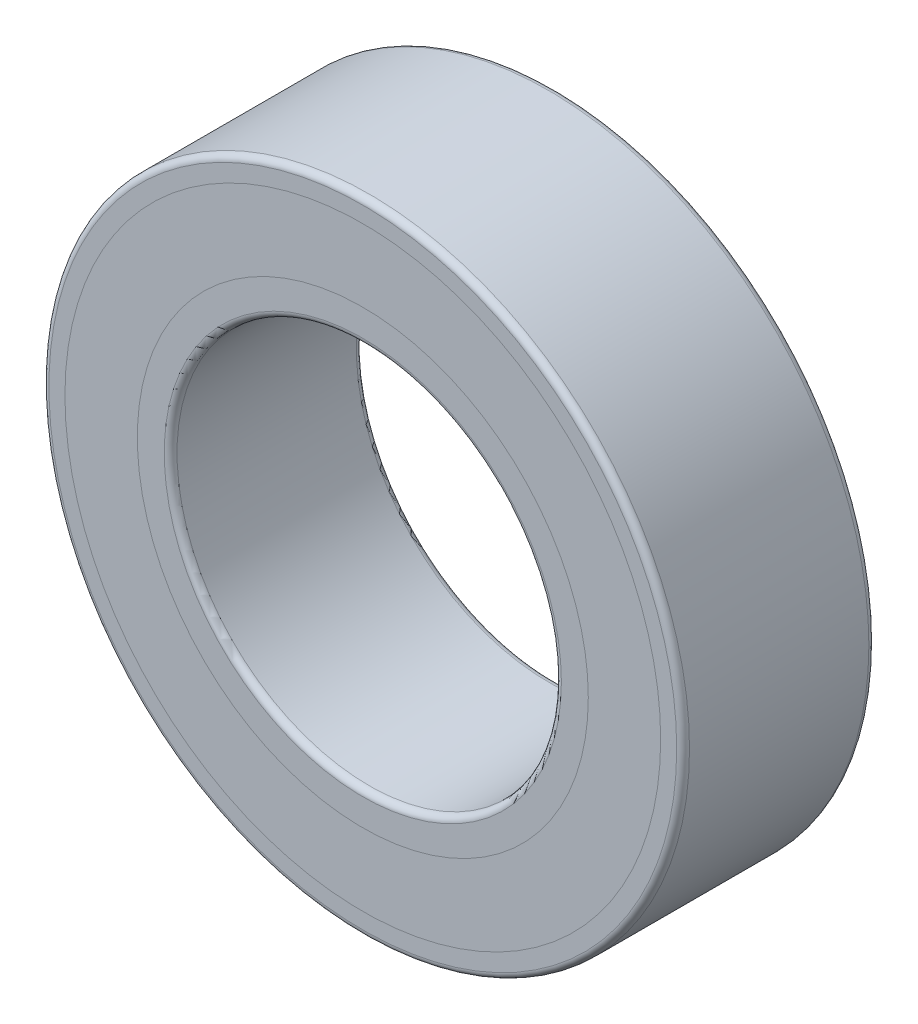
ISO-10303-21;
HEADER;
FILE_DESCRIPTION(('STEP AP214'),'2;1');
FILE_NAME('part.step','',(''),(''),'','','');
FILE_SCHEMA(('AUTOMOTIVE_DESIGN { 1 0 10303 214 1 1 1 1 }'));
ENDSEC;
DATA;
#1=APPLICATION_CONTEXT('core data for automotive mechanical design processes');
#2=APPLICATION_PROTOCOL_DEFINITION('international standard','automotive_design',2000,#1);
#3=PRODUCT_CONTEXT('',#1,'mechanical');
#4=PRODUCT('Part','Part','',(#3));
#5=PRODUCT_RELATED_PRODUCT_CATEGORY('part','',(#4));
#6=PRODUCT_DEFINITION_FORMATION('','',#4);
#7=PRODUCT_DEFINITION_CONTEXT('part definition',#1,'design');
#8=PRODUCT_DEFINITION('design','',#6,#7);
#9=PRODUCT_DEFINITION_SHAPE('','',#8);
#10=(LENGTH_UNIT() NAMED_UNIT(*) SI_UNIT(.MILLI.,.METRE.));
#11=(NAMED_UNIT(*) PLANE_ANGLE_UNIT() SI_UNIT($,.RADIAN.));
#12=(NAMED_UNIT(*) SI_UNIT($,.STERADIAN.) SOLID_ANGLE_UNIT());
#13=UNCERTAINTY_MEASURE_WITH_UNIT(LENGTH_MEASURE(1.E-05),#10,'distance_accuracy_value','');
#14=(GEOMETRIC_REPRESENTATION_CONTEXT(3) GLOBAL_UNCERTAINTY_ASSIGNED_CONTEXT((#13)) GLOBAL_UNIT_ASSIGNED_CONTEXT((#10,
#11,#12)) REPRESENTATION_CONTEXT('',''));
#15=CARTESIAN_POINT('',(0.,0.,0.));
#16=DIRECTION('',(0.,0.,1.));
#17=DIRECTION('',(1.,0.,0.));
#18=AXIS2_PLACEMENT_3D('',#15,#16,#17);
#19=CARTESIAN_POINT('',(0.,0.,3.));
#20=DIRECTION('',(0.,0.,1.));
#21=DIRECTION('',(1.,0.,0.));
#22=AXIS2_PLACEMENT_3D('',#19,#20,#21);
#23=PLANE('',#22);
#24=CARTESIAN_POINT('',(0.,0.,3.));
#25=DIRECTION('',(0.,0.,1.));
#26=DIRECTION('',(1.,0.,0.));
#27=AXIS2_PLACEMENT_3D('',#24,#25,#26);
#28=CIRCLE('',#27,4.65);
#29=CARTESIAN_POINT('',(4.65,0.,3.));
#30=VERTEX_POINT('',#29);
#31=EDGE_CURVE('E77',#30,#30,#28,.F.);
#32=ORIENTED_EDGE('',*,*,#31,.F.);
#33=EDGE_LOOP('',(#32));
#34=FACE_BOUND('',#33,.T.);
#35=CARTESIAN_POINT('',(0.,0.,3.));
#36=DIRECTION('',(0.,0.,1.));
#37=DIRECTION('',(1.,0.,0.));
#38=AXIS2_PLACEMENT_3D('',#35,#36,#37);
#39=CIRCLE('',#38,3.52);
#40=CARTESIAN_POINT('',(3.52,0.,3.));
#41=VERTEX_POINT('',#40);
#42=EDGE_CURVE('E68',#41,#41,#39,.F.);
#43=ORIENTED_EDGE('',*,*,#42,.T.);
#44=EDGE_LOOP('',(#43));
#45=FACE_BOUND('',#44,.T.);
#46=ADVANCED_FACE('F36',(#34,#45),#23,.T.);
#47=CARTESIAN_POINT('',(0.,0.,0.));
#48=DIRECTION('',(0.,0.,1.));
#49=DIRECTION('',(1.,0.,0.));
#50=AXIS2_PLACEMENT_3D('',#47,#48,#49);
#51=PLANE('',#50);
#52=CARTESIAN_POINT('',(0.,0.,0.));
#53=DIRECTION('',(0.,0.,1.));
#54=DIRECTION('',(1.,0.,0.));
#55=AXIS2_PLACEMENT_3D('',#52,#53,#54);
#56=CIRCLE('',#55,4.65);
#57=CARTESIAN_POINT('',(4.65,0.,0.));
#58=VERTEX_POINT('',#57);
#59=EDGE_CURVE('E73',#58,#58,#56,.F.);
#60=ORIENTED_EDGE('',*,*,#59,.T.);
#61=EDGE_LOOP('',(#60));
#62=FACE_BOUND('',#61,.T.);
#63=CARTESIAN_POINT('',(0.,0.,0.));
#64=DIRECTION('',(0.,0.,1.));
#65=DIRECTION('',(1.,0.,0.));
#66=AXIS2_PLACEMENT_3D('',#63,#64,#65);
#67=CIRCLE('',#66,3.52);
#68=CARTESIAN_POINT('',(3.52,0.,0.));
#69=VERTEX_POINT('',#68);
#70=EDGE_CURVE('E69',#69,#69,#67,.F.);
#71=ORIENTED_EDGE('',*,*,#70,.F.);
#72=EDGE_LOOP('',(#71));
#73=FACE_BOUND('',#72,.T.);
#74=ADVANCED_FACE('F87',(#62,#73),#51,.F.);
#75=CARTESIAN_POINT('',(0.,0.,0.));
#76=DIRECTION('',(0.,0.,1.));
#77=DIRECTION('',(1.,0.,0.));
#78=AXIS2_PLACEMENT_3D('',#75,#76,#77);
#79=CIRCLE('',#78,4.9);
#80=CARTESIAN_POINT('',(4.9,0.,0.));
#81=VERTEX_POINT('',#80);
#82=EDGE_CURVE('E43',#81,#81,#79,.F.);
#83=ORIENTED_EDGE('',*,*,#82,.T.);
#84=EDGE_LOOP('',(#83));
#85=FACE_BOUND('',#84,.T.);
#86=ORIENTED_EDGE('',*,*,#59,.F.);
#87=EDGE_LOOP('',(#86));
#88=FACE_BOUND('',#87,.T.);
#89=ADVANCED_FACE('F90',(#85,#88),#51,.F.);
#90=CARTESIAN_POINT('',(0.,0.,3.));
#91=DIRECTION('',(0.,0.,1.));
#92=DIRECTION('',(1.,0.,0.));
#93=AXIS2_PLACEMENT_3D('',#90,#91,#92);
#94=CIRCLE('',#93,4.9);
#95=CARTESIAN_POINT('',(4.9,0.,3.));
#96=VERTEX_POINT('',#95);
#97=EDGE_CURVE('E10',#96,#96,#94,.T.);
#98=ORIENTED_EDGE('',*,*,#97,.T.);
#99=EDGE_LOOP('',(#98));
#100=FACE_BOUND('',#99,.T.);
#101=ORIENTED_EDGE('',*,*,#31,.T.);
#102=EDGE_LOOP('',(#101));
#103=FACE_BOUND('',#102,.T.);
#104=ADVANCED_FACE('F92',(#100,#103),#23,.T.);
#105=CARTESIAN_POINT('',(0.,0.,3.));
#106=DIRECTION('',(0.,0.,1.));
#107=DIRECTION('',(1.,0.,0.));
#108=AXIS2_PLACEMENT_3D('',#105,#106,#107);
#109=CIRCLE('',#108,3.1);
#110=CARTESIAN_POINT('',(3.1,0.,3.));
#111=VERTEX_POINT('',#110);
#112=EDGE_CURVE('E56',#111,#111,#109,.F.);
#113=ORIENTED_EDGE('',*,*,#112,.T.);
#114=EDGE_LOOP('',(#113));
#115=FACE_BOUND('',#114,.T.);
#116=ORIENTED_EDGE('',*,*,#42,.F.);
#117=EDGE_LOOP('',(#116));
#118=FACE_BOUND('',#117,.T.);
#119=ADVANCED_FACE('F99',(#115,#118),#23,.T.);
#120=CARTESIAN_POINT('',(0.,0.,0.));
#121=DIRECTION('',(0.,0.,1.));
#122=DIRECTION('',(1.,0.,0.));
#123=AXIS2_PLACEMENT_3D('',#120,#121,#122);
#124=CIRCLE('',#123,3.1);
#125=CARTESIAN_POINT('',(3.1,0.,0.));
#126=VERTEX_POINT('',#125);
#127=EDGE_CURVE('E65',#126,#126,#124,.T.);
#128=ORIENTED_EDGE('',*,*,#127,.T.);
#129=EDGE_LOOP('',(#128));
#130=FACE_BOUND('',#129,.T.);
#131=ORIENTED_EDGE('',*,*,#70,.T.);
#132=EDGE_LOOP('',(#131));
#133=FACE_BOUND('',#132,.T.);
#134=ADVANCED_FACE('F94',(#130,#133),#51,.F.);
#135=CARTESIAN_POINT('',(0.,0.,3.));
#136=DIRECTION('',(0.,0.,-1.));
#137=DIRECTION('',(-1.,0.,0.));
#138=AXIS2_PLACEMENT_3D('',#135,#136,#137);
#139=CYLINDRICAL_SURFACE('',#138,5.);
#140=CARTESIAN_POINT('',(0.,0.,0.0999999999999998));
#141=DIRECTION('',(0.,0.,1.));
#142=DIRECTION('',(1.,0.,0.));
#143=AXIS2_PLACEMENT_3D('',#140,#141,#142);
#144=CIRCLE('',#143,5.);
#145=CARTESIAN_POINT('',(5.,0.,0.0999999999999998));
#146=VERTEX_POINT('',#145);
#147=EDGE_CURVE('E47',#146,#146,#144,.T.);
#148=ORIENTED_EDGE('',*,*,#147,.T.);
#149=EDGE_LOOP('',(#148));
#150=FACE_BOUND('',#149,.T.);
#151=CARTESIAN_POINT('',(0.,0.,2.9));
#152=DIRECTION('',(0.,0.,1.));
#153=DIRECTION('',(1.,0.,0.));
#154=AXIS2_PLACEMENT_3D('',#151,#152,#153);
#155=CIRCLE('',#154,5.);
#156=CARTESIAN_POINT('',(5.,0.,2.9));
#157=VERTEX_POINT('',#156);
#158=EDGE_CURVE('E51',#157,#157,#155,.F.);
#159=ORIENTED_EDGE('',*,*,#158,.T.);
#160=EDGE_LOOP('',(#159));
#161=FACE_BOUND('',#160,.T.);
#162=ADVANCED_FACE('F103',(#150,#161),#139,.T.);
#163=CARTESIAN_POINT('',(0.,0.,3.));
#164=DIRECTION('',(0.,0.,-1.));
#165=DIRECTION('',(-1.,0.,0.));
#166=AXIS2_PLACEMENT_3D('',#163,#164,#165);
#167=CYLINDRICAL_SURFACE('',#166,3.);
#168=CARTESIAN_POINT('',(0.,0.,0.0999999999999998));
#169=DIRECTION('',(0.,0.,1.));
#170=DIRECTION('',(1.,0.,0.));
#171=AXIS2_PLACEMENT_3D('',#168,#169,#170);
#172=CIRCLE('',#171,3.);
#173=CARTESIAN_POINT('',(3.,0.,0.0999999999999998));
#174=VERTEX_POINT('',#173);
#175=EDGE_CURVE('E59',#174,#174,#172,.F.);
#176=ORIENTED_EDGE('',*,*,#175,.T.);
#177=EDGE_LOOP('',(#176));
#178=FACE_BOUND('',#177,.T.);
#179=CARTESIAN_POINT('',(0.,0.,2.9));
#180=DIRECTION('',(0.,0.,1.));
#181=DIRECTION('',(1.,0.,0.));
#182=AXIS2_PLACEMENT_3D('',#179,#180,#181);
#183=CIRCLE('',#182,3.);
#184=CARTESIAN_POINT('',(3.,0.,2.9));
#185=VERTEX_POINT('',#184);
#186=EDGE_CURVE('E62',#185,#185,#183,.T.);
#187=ORIENTED_EDGE('',*,*,#186,.T.);
#188=EDGE_LOOP('',(#187));
#189=FACE_BOUND('',#188,.T.);
#190=ADVANCED_FACE('F128',(#178,#189),#167,.F.);
#191=CARTESIAN_POINT('',(0.,0.,0.0999999999999998));
#192=DIRECTION('',(0.,0.,1.));
#193=DIRECTION('',(1.,0.,0.));
#194=AXIS2_PLACEMENT_3D('',#191,#192,#193);
#195=TOROIDAL_SURFACE('',#194,3.1,0.1);
#196=ORIENTED_EDGE('',*,*,#175,.F.);
#197=EDGE_LOOP('',(#196));
#198=FACE_BOUND('',#197,.T.);
#199=ORIENTED_EDGE('',*,*,#127,.F.);
#200=EDGE_LOOP('',(#199));
#201=FACE_BOUND('',#200,.T.);
#202=ADVANCED_FACE('F124',(#198,#201),#195,.T.);
#203=CARTESIAN_POINT('',(0.,0.,2.9));
#204=DIRECTION('',(0.,0.,1.));
#205=DIRECTION('',(1.,0.,0.));
#206=AXIS2_PLACEMENT_3D('',#203,#204,#205);
#207=TOROIDAL_SURFACE('',#206,3.1,0.1);
#208=ORIENTED_EDGE('',*,*,#112,.F.);
#209=EDGE_LOOP('',(#208));
#210=FACE_BOUND('',#209,.T.);
#211=ORIENTED_EDGE('',*,*,#186,.F.);
#212=EDGE_LOOP('',(#211));
#213=FACE_BOUND('',#212,.T.);
#214=ADVANCED_FACE('F120',(#210,#213),#207,.T.);
#215=CARTESIAN_POINT('',(0.,0.,0.0999999999999998));
#216=DIRECTION('',(0.,0.,1.));
#217=DIRECTION('',(1.,0.,0.));
#218=AXIS2_PLACEMENT_3D('',#215,#216,#217);
#219=TOROIDAL_SURFACE('',#218,4.9,0.1);
#220=ORIENTED_EDGE('',*,*,#82,.F.);
#221=EDGE_LOOP('',(#220));
#222=FACE_BOUND('',#221,.T.);
#223=ORIENTED_EDGE('',*,*,#147,.F.);
#224=EDGE_LOOP('',(#223));
#225=FACE_BOUND('',#224,.T.);
#226=ADVANCED_FACE('F123',(#222,#225),#219,.T.);
#227=CARTESIAN_POINT('',(0.,0.,2.9));
#228=DIRECTION('',(0.,0.,1.));
#229=DIRECTION('',(1.,0.,0.));
#230=AXIS2_PLACEMENT_3D('',#227,#228,#229);
#231=TOROIDAL_SURFACE('',#230,4.9,0.1);
#232=ORIENTED_EDGE('',*,*,#158,.F.);
#233=EDGE_LOOP('',(#232));
#234=FACE_BOUND('',#233,.T.);
#235=ORIENTED_EDGE('',*,*,#97,.F.);
#236=EDGE_LOOP('',(#235));
#237=FACE_BOUND('',#236,.T.);
#238=ADVANCED_FACE('F38',(#234,#237),#231,.T.);
#239=CLOSED_SHELL('',(#46,#74,#89,#104,#119,#134,#162,#190,#202,#214,#226,#238));
#240=MANIFOLD_SOLID_BREP('B2',#239);
#241=ADVANCED_BREP_SHAPE_REPRESENTATION('',(#18,#240),#14);
#242=SHAPE_DEFINITION_REPRESENTATION(#9,#241);
ENDSEC;
END-ISO-10303-21;
